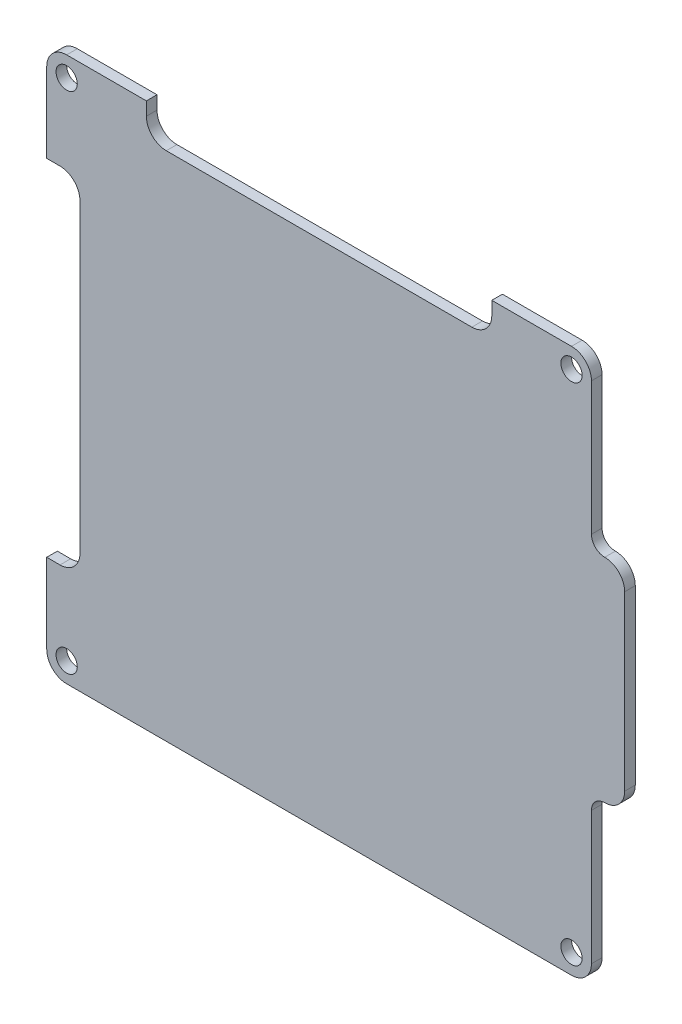
ISO-10303-21;
HEADER;
FILE_DESCRIPTION(('STEP AP214'),'2;1');
FILE_NAME('part.step','',(''),(''),'','','');
FILE_SCHEMA(('AUTOMOTIVE_DESIGN { 1 0 10303 214 1 1 1 1 }'));
ENDSEC;
DATA;
#1=APPLICATION_CONTEXT('core data for automotive mechanical design processes');
#2=APPLICATION_PROTOCOL_DEFINITION('international standard','automotive_design',2000,#1);
#3=PRODUCT_CONTEXT('',#1,'mechanical');
#4=PRODUCT('Part','Part','',(#3));
#5=PRODUCT_RELATED_PRODUCT_CATEGORY('part','',(#4));
#6=PRODUCT_DEFINITION_FORMATION('','',#4);
#7=PRODUCT_DEFINITION_CONTEXT('part definition',#1,'design');
#8=PRODUCT_DEFINITION('design','',#6,#7);
#9=PRODUCT_DEFINITION_SHAPE('','',#8);
#10=(LENGTH_UNIT() NAMED_UNIT(*) SI_UNIT(.MILLI.,.METRE.));
#11=(NAMED_UNIT(*) PLANE_ANGLE_UNIT() SI_UNIT($,.RADIAN.));
#12=(NAMED_UNIT(*) SI_UNIT($,.STERADIAN.) SOLID_ANGLE_UNIT());
#13=UNCERTAINTY_MEASURE_WITH_UNIT(LENGTH_MEASURE(1.E-05),#10,'distance_accuracy_value','');
#14=(GEOMETRIC_REPRESENTATION_CONTEXT(3) GLOBAL_UNCERTAINTY_ASSIGNED_CONTEXT((#13)) GLOBAL_UNIT_ASSIGNED_CONTEXT((#10,
#11,#12)) REPRESENTATION_CONTEXT('',''));
#15=CARTESIAN_POINT('',(0.,0.,0.));
#16=DIRECTION('',(0.,0.,1.));
#17=DIRECTION('',(1.,0.,0.));
#18=AXIS2_PLACEMENT_3D('',#15,#16,#17);
#19=CARTESIAN_POINT('',(-0.499999999999993,61.75,-1.6));
#20=DIRECTION('',(0.,0.,1.));
#21=DIRECTION('',(1.,0.,0.));
#22=AXIS2_PLACEMENT_3D('',#19,#20,#21);
#23=PLANE('',#22);
#24=CARTESIAN_POINT('',(-79.5000000000002,7.75000000000047,-1.6));
#25=DIRECTION('',(0.,0.,-1.));
#26=DIRECTION('',(-1.,0.,0.));
#27=AXIS2_PLACEMENT_3D('',#24,#25,#26);
#28=CIRCLE('',#27,1.59999999999999);
#29=CARTESIAN_POINT('',(-81.1000000000002,7.75000000000047,-1.6));
#30=VERTEX_POINT('',#29);
#31=EDGE_CURVE('E559',#30,#30,#28,.T.);
#32=ORIENTED_EDGE('',*,*,#31,.F.);
#33=EDGE_LOOP('',(#32));
#34=FACE_BOUND('',#33,.T.);
#35=DIRECTION('',(0.,1.,0.));
#36=VECTOR('',#35,1.);
#37=CARTESIAN_POINT('',(4.50000000000001,61.75,-1.6));
#38=LINE('',#37,#36);
#39=CARTESIAN_POINT('',(4.50000000000001,32.7500000000003,-1.6));
#40=VERTEX_POINT('',#39);
#41=CARTESIAN_POINT('',(4.50000000000001,58.75,-1.6));
#42=VERTEX_POINT('',#41);
#43=EDGE_CURVE('E226',#40,#42,#38,.T.);
#44=ORIENTED_EDGE('',*,*,#43,.F.);
#45=CARTESIAN_POINT('',(1.50000000000001,32.7500000000003,-1.6));
#46=DIRECTION('',(0.,0.,1.));
#47=DIRECTION('',(1.,0.,0.));
#48=AXIS2_PLACEMENT_3D('',#45,#46,#47);
#49=CIRCLE('',#48,3.);
#50=CARTESIAN_POINT('',(1.50000000000001,29.7500000000003,-1.6));
#51=VERTEX_POINT('',#50);
#52=EDGE_CURVE('E339',#40,#51,#49,.F.);
#53=ORIENTED_EDGE('',*,*,#52,.T.);
#54=CARTESIAN_POINT('',(1.50000000000001,27.7500000000003,-1.6));
#55=DIRECTION('',(0.,0.,1.));
#56=DIRECTION('',(1.,0.,0.));
#57=AXIS2_PLACEMENT_3D('',#54,#55,#56);
#58=CIRCLE('',#57,2.);
#59=CARTESIAN_POINT('',(-0.499999999999986,27.7500000000003,-1.6));
#60=VERTEX_POINT('',#59);
#61=EDGE_CURVE('E403',#51,#60,#58,.T.);
#62=ORIENTED_EDGE('',*,*,#61,.T.);
#63=DIRECTION('',(0.,1.,0.));
#64=VECTOR('',#63,1.);
#65=CARTESIAN_POINT('',(-0.499999999999987,29.7500000000003,-1.6));
#66=LINE('',#65,#64);
#67=CARTESIAN_POINT('',(-0.499999999999974,7.74999999999997,-1.6));
#68=VERTEX_POINT('',#67);
#69=EDGE_CURVE('E260',#68,#60,#66,.T.);
#70=ORIENTED_EDGE('',*,*,#69,.F.);
#71=CARTESIAN_POINT('',(-3.49999999999997,7.74999999999996,-1.6));
#72=DIRECTION('',(0.,0.,1.));
#73=DIRECTION('',(1.,0.,0.));
#74=AXIS2_PLACEMENT_3D('',#71,#72,#73);
#75=CIRCLE('',#74,3.);
#76=CARTESIAN_POINT('',(-3.49999999999997,4.74999999999996,-1.6));
#77=VERTEX_POINT('',#76);
#78=EDGE_CURVE('E333',#68,#77,#75,.F.);
#79=ORIENTED_EDGE('',*,*,#78,.T.);
#80=DIRECTION('',(1.,0.,0.));
#81=VECTOR('',#80,1.);
#82=CARTESIAN_POINT('',(-0.499999999999973,4.74999999999996,-1.6));
#83=LINE('',#82,#81);
#84=CARTESIAN_POINT('',(-79.5,4.74999999999995,-1.6));
#85=VERTEX_POINT('',#84);
#86=EDGE_CURVE('E257',#85,#77,#83,.T.);
#87=ORIENTED_EDGE('',*,*,#86,.F.);
#88=CARTESIAN_POINT('',(-79.5,7.74999999999995,-1.6));
#89=DIRECTION('',(0.,0.,1.));
#90=DIRECTION('',(1.,0.,0.));
#91=AXIS2_PLACEMENT_3D('',#88,#89,#90);
#92=CIRCLE('',#91,3.);
#93=CARTESIAN_POINT('',(-82.5,7.74999999999995,-1.6));
#94=VERTEX_POINT('',#93);
#95=EDGE_CURVE('E331',#85,#94,#92,.F.);
#96=ORIENTED_EDGE('',*,*,#95,.T.);
#97=DIRECTION('',(0.,-1.,0.));
#98=VECTOR('',#97,1.);
#99=CARTESIAN_POINT('',(-82.5,19.7500000000006,-1.6));
#100=LINE('',#99,#98);
#101=CARTESIAN_POINT('',(-82.5,19.7500000000006,-1.6));
#102=VERTEX_POINT('',#101);
#103=EDGE_CURVE('E254',#102,#94,#100,.T.);
#104=ORIENTED_EDGE('',*,*,#103,.F.);
#105=DIRECTION('',(-1.,0.,0.));
#106=VECTOR('',#105,1.);
#107=CARTESIAN_POINT('',(-77.5,19.7500000000006,-1.6));
#108=LINE('',#107,#106);
#109=CARTESIAN_POINT('',(-80.5,19.7500000000006,-1.6));
#110=VERTEX_POINT('',#109);
#111=EDGE_CURVE('E252',#110,#102,#108,.T.);
#112=ORIENTED_EDGE('',*,*,#111,.F.);
#113=CARTESIAN_POINT('',(-80.5,22.7500000000006,-1.6));
#114=DIRECTION('',(0.,0.,1.));
#115=DIRECTION('',(1.,0.,0.));
#116=AXIS2_PLACEMENT_3D('',#113,#114,#115);
#117=CIRCLE('',#116,3.);
#118=CARTESIAN_POINT('',(-77.5,22.7500000000006,-1.6));
#119=VERTEX_POINT('',#118);
#120=EDGE_CURVE('E395',#110,#119,#117,.T.);
#121=ORIENTED_EDGE('',*,*,#120,.T.);
#122=DIRECTION('',(0.,-1.,0.));
#123=VECTOR('',#122,1.);
#124=CARTESIAN_POINT('',(-77.5,71.7499999999999,-1.6));
#125=LINE('',#124,#123);
#126=CARTESIAN_POINT('',(-77.5,68.7499999999999,-1.6));
#127=VERTEX_POINT('',#126);
#128=EDGE_CURVE('E249',#127,#119,#125,.T.);
#129=ORIENTED_EDGE('',*,*,#128,.F.);
#130=CARTESIAN_POINT('',(-80.5,68.7499999999999,-1.6));
#131=DIRECTION('',(0.,0.,1.));
#132=DIRECTION('',(1.,0.,0.));
#133=AXIS2_PLACEMENT_3D('',#130,#131,#132);
#134=CIRCLE('',#133,3.);
#135=CARTESIAN_POINT('',(-80.5,71.7499999999999,-1.6));
#136=VERTEX_POINT('',#135);
#137=EDGE_CURVE('E391',#127,#136,#134,.T.);
#138=ORIENTED_EDGE('',*,*,#137,.T.);
#139=DIRECTION('',(1.,0.,0.));
#140=VECTOR('',#139,1.);
#141=CARTESIAN_POINT('',(-82.5,71.7499999999999,-1.6));
#142=LINE('',#141,#140);
#143=CARTESIAN_POINT('',(-82.5,71.7499999999999,-1.6));
#144=VERTEX_POINT('',#143);
#145=EDGE_CURVE('E246',#144,#136,#142,.T.);
#146=ORIENTED_EDGE('',*,*,#145,.F.);
#147=DIRECTION('',(0.,-1.,0.));
#148=VECTOR('',#147,1.);
#149=CARTESIAN_POINT('',(-82.5,86.75,-1.6));
#150=LINE('',#149,#148);
#151=CARTESIAN_POINT('',(-82.5,83.75,-1.6));
#152=VERTEX_POINT('',#151);
#153=EDGE_CURVE('E244',#152,#144,#150,.T.);
#154=ORIENTED_EDGE('',*,*,#153,.F.);
#155=CARTESIAN_POINT('',(-79.5,83.75,-1.6));
#156=DIRECTION('',(0.,0.,1.));
#157=DIRECTION('',(1.,0.,0.));
#158=AXIS2_PLACEMENT_3D('',#155,#156,#157);
#159=CIRCLE('',#158,3.);
#160=CARTESIAN_POINT('',(-79.5,86.75,-1.6));
#161=VERTEX_POINT('',#160);
#162=EDGE_CURVE('E329',#152,#161,#159,.F.);
#163=ORIENTED_EDGE('',*,*,#162,.T.);
#164=DIRECTION('',(-1.,0.,0.));
#165=VECTOR('',#164,1.);
#166=CARTESIAN_POINT('',(-67.5,86.7499999999999,-1.6));
#167=LINE('',#166,#165);
#168=CARTESIAN_POINT('',(-67.5,86.7499999999999,-1.6));
#169=VERTEX_POINT('',#168);
#170=EDGE_CURVE('E241',#169,#161,#167,.T.);
#171=ORIENTED_EDGE('',*,*,#170,.F.);
#172=DIRECTION('',(0.,1.,0.));
#173=VECTOR('',#172,1.);
#174=CARTESIAN_POINT('',(-67.5,81.7499999999999,-1.6));
#175=LINE('',#174,#173);
#176=CARTESIAN_POINT('',(-67.5,84.7499999999999,-1.6));
#177=VERTEX_POINT('',#176);
#178=EDGE_CURVE('E236',#177,#169,#175,.T.);
#179=ORIENTED_EDGE('',*,*,#178,.F.);
#180=CARTESIAN_POINT('',(-64.5,84.7499999999999,-1.6));
#181=DIRECTION('',(0.,0.,1.));
#182=DIRECTION('',(1.,0.,0.));
#183=AXIS2_PLACEMENT_3D('',#180,#181,#182);
#184=CIRCLE('',#183,3.);
#185=CARTESIAN_POINT('',(-64.5,81.7499999999999,-1.6));
#186=VERTEX_POINT('',#185);
#187=EDGE_CURVE('E384',#177,#186,#184,.T.);
#188=ORIENTED_EDGE('',*,*,#187,.T.);
#189=DIRECTION('',(-1.,0.,0.));
#190=VECTOR('',#189,1.);
#191=CARTESIAN_POINT('',(-15.5,81.7499999999999,-1.6));
#192=LINE('',#191,#190);
#193=CARTESIAN_POINT('',(-18.4999999999999,81.7499999999999,-1.6));
#194=VERTEX_POINT('',#193);
#195=EDGE_CURVE('E233',#194,#186,#192,.T.);
#196=ORIENTED_EDGE('',*,*,#195,.F.);
#197=CARTESIAN_POINT('',(-18.4999999999999,84.7499999999999,-1.6));
#198=DIRECTION('',(0.,0.,1.));
#199=DIRECTION('',(1.,0.,0.));
#200=AXIS2_PLACEMENT_3D('',#197,#198,#199);
#201=CIRCLE('',#200,3.);
#202=CARTESIAN_POINT('',(-15.4999999999999,84.7499999999998,-1.6));
#203=VERTEX_POINT('',#202);
#204=EDGE_CURVE('E232',#194,#203,#201,.T.);
#205=ORIENTED_EDGE('',*,*,#204,.T.);
#206=DIRECTION('',(0.,-1.,0.));
#207=VECTOR('',#206,1.);
#208=CARTESIAN_POINT('',(-15.4999999999998,86.7499999999999,-1.6));
#209=LINE('',#208,#207);
#210=CARTESIAN_POINT('',(-15.4999999999998,86.7499999999999,-1.6));
#211=VERTEX_POINT('',#210);
#212=EDGE_CURVE('E215',#211,#203,#209,.T.);
#213=ORIENTED_EDGE('',*,*,#212,.F.);
#214=DIRECTION('',(-1.,0.,0.));
#215=VECTOR('',#214,1.);
#216=CARTESIAN_POINT('',(-0.499999999999983,86.75,-1.6));
#217=LINE('',#216,#215);
#218=CARTESIAN_POINT('',(-3.50000000000001,86.75,-1.6));
#219=VERTEX_POINT('',#218);
#220=EDGE_CURVE('E203',#219,#211,#217,.T.);
#221=ORIENTED_EDGE('',*,*,#220,.F.);
#222=CARTESIAN_POINT('',(-3.49999999999998,83.75,-1.6));
#223=DIRECTION('',(0.,0.,1.));
#224=DIRECTION('',(1.,0.,0.));
#225=AXIS2_PLACEMENT_3D('',#222,#223,#224);
#226=CIRCLE('',#225,3.);
#227=CARTESIAN_POINT('',(-0.499999999999984,83.75,-1.6));
#228=VERTEX_POINT('',#227);
#229=EDGE_CURVE('E335',#219,#228,#226,.F.);
#230=ORIENTED_EDGE('',*,*,#229,.T.);
#231=DIRECTION('',(0.,1.,0.));
#232=VECTOR('',#231,1.);
#233=CARTESIAN_POINT('',(-0.499999999999983,86.75,-1.6));
#234=LINE('',#233,#232);
#235=CARTESIAN_POINT('',(-0.499999999999992,63.75,-1.6));
#236=VERTEX_POINT('',#235);
#237=EDGE_CURVE('E216',#236,#228,#234,.T.);
#238=ORIENTED_EDGE('',*,*,#237,.F.);
#239=CARTESIAN_POINT('',(1.50000000000001,63.75,-1.6));
#240=DIRECTION('',(0.,0.,1.));
#241=DIRECTION('',(1.,0.,0.));
#242=AXIS2_PLACEMENT_3D('',#239,#240,#241);
#243=CIRCLE('',#242,2.);
#244=CARTESIAN_POINT('',(1.50000000000001,61.75,-1.6));
#245=VERTEX_POINT('',#244);
#246=EDGE_CURVE('E11',#236,#245,#243,.T.);
#247=ORIENTED_EDGE('',*,*,#246,.T.);
#248=CARTESIAN_POINT('',(1.50000000000001,58.75,-1.6));
#249=DIRECTION('',(0.,0.,1.));
#250=DIRECTION('',(1.,0.,0.));
#251=AXIS2_PLACEMENT_3D('',#248,#249,#250);
#252=CIRCLE('',#251,3.);
#253=EDGE_CURVE('E337',#245,#42,#252,.F.);
#254=ORIENTED_EDGE('',*,*,#253,.T.);
#255=EDGE_LOOP('',(#44,#53,#62,#70,#79,#87,#96,#104,#112,#121,#129,#138,#146,#154,#163,#171,
#179,#188,#196,#205,#213,#221,#230,#238,#247,#254));
#256=FACE_BOUND('',#255,.T.);
#257=CARTESIAN_POINT('',(-79.5000000000002,83.7500000000005,-1.6));
#258=DIRECTION('',(0.,0.,-1.));
#259=DIRECTION('',(-1.,0.,0.));
#260=AXIS2_PLACEMENT_3D('',#257,#258,#259);
#261=CIRCLE('',#260,1.59999999999999);
#262=CARTESIAN_POINT('',(-81.1000000000002,83.7500000000005,-1.6));
#263=VERTEX_POINT('',#262);
#264=EDGE_CURVE('E553',#263,#263,#261,.T.);
#265=ORIENTED_EDGE('',*,*,#264,.F.);
#266=EDGE_LOOP('',(#265));
#267=FACE_BOUND('',#266,.T.);
#268=CARTESIAN_POINT('',(-3.50000000000006,7.75000000000042,-1.6));
#269=DIRECTION('',(0.,0.,-1.));
#270=DIRECTION('',(-1.,0.,0.));
#271=AXIS2_PLACEMENT_3D('',#268,#269,#270);
#272=CIRCLE('',#271,1.59999999999999);
#273=CARTESIAN_POINT('',(-5.10000000000005,7.75000000000042,-1.6));
#274=VERTEX_POINT('',#273);
#275=EDGE_CURVE('E565',#274,#274,#272,.T.);
#276=ORIENTED_EDGE('',*,*,#275,.F.);
#277=EDGE_LOOP('',(#276));
#278=FACE_BOUND('',#277,.T.);
#279=CARTESIAN_POINT('',(-3.49999999999998,83.7500000000004,-1.6));
#280=DIRECTION('',(0.,0.,-1.));
#281=DIRECTION('',(-1.,0.,0.));
#282=AXIS2_PLACEMENT_3D('',#279,#280,#281);
#283=CIRCLE('',#282,1.59999999999999);
#284=CARTESIAN_POINT('',(-5.09999999999996,83.7500000000004,-1.6));
#285=VERTEX_POINT('',#284);
#286=EDGE_CURVE('E571',#285,#285,#283,.T.);
#287=ORIENTED_EDGE('',*,*,#286,.F.);
#288=EDGE_LOOP('',(#287));
#289=FACE_BOUND('',#288,.T.);
#290=ADVANCED_FACE('F32',(#34,#256,#267,#278,#289),#23,.F.);
#291=CARTESIAN_POINT('',(-0.499999999999983,86.75,-1.6));
#292=DIRECTION('',(1.,0.,0.));
#293=DIRECTION('',(0.,1.,0.));
#294=AXIS2_PLACEMENT_3D('',#291,#292,#293);
#295=PLANE('',#294);
#296=DIRECTION('',(0.,1.,0.));
#297=VECTOR('',#296,1.);
#298=CARTESIAN_POINT('',(-0.499999999999983,86.75,0.));
#299=LINE('',#298,#297);
#300=CARTESIAN_POINT('',(-0.499999999999992,63.75,0.));
#301=VERTEX_POINT('',#300);
#302=CARTESIAN_POINT('',(-0.499999999999984,83.75,0.));
#303=VERTEX_POINT('',#302);
#304=EDGE_CURVE('E265',#301,#303,#299,.T.);
#305=ORIENTED_EDGE('',*,*,#304,.F.);
#306=DIRECTION('',(0.,0.,1.));
#307=VECTOR('',#306,1.);
#308=CARTESIAN_POINT('',(-0.499999999999992,63.75,-1.6));
#309=LINE('',#308,#307);
#310=EDGE_CURVE('E53',#301,#236,#309,.F.);
#311=ORIENTED_EDGE('',*,*,#310,.T.);
#312=ORIENTED_EDGE('',*,*,#237,.T.);
#313=DIRECTION('',(0.,0.,1.));
#314=VECTOR('',#313,1.);
#315=CARTESIAN_POINT('',(-0.499999999999984,83.75,-1.6));
#316=LINE('',#315,#314);
#317=EDGE_CURVE('E344',#228,#303,#316,.T.);
#318=ORIENTED_EDGE('',*,*,#317,.T.);
#319=EDGE_LOOP('',(#305,#311,#312,#318));
#320=FACE_BOUND('',#319,.T.);
#321=ADVANCED_FACE('F437',(#320),#295,.T.);
#322=CARTESIAN_POINT('',(4.50000000000001,61.75,-1.6));
#323=DIRECTION('',(1.,0.,0.));
#324=DIRECTION('',(0.,1.,0.));
#325=AXIS2_PLACEMENT_3D('',#322,#323,#324);
#326=PLANE('',#325);
#327=DIRECTION('',(0.,1.,0.));
#328=VECTOR('',#327,1.);
#329=CARTESIAN_POINT('',(4.50000000000001,61.75,0.));
#330=LINE('',#329,#328);
#331=CARTESIAN_POINT('',(4.50000000000001,32.7500000000003,0.));
#332=VERTEX_POINT('',#331);
#333=CARTESIAN_POINT('',(4.50000000000001,58.75,0.));
#334=VERTEX_POINT('',#333);
#335=EDGE_CURVE('E298',#332,#334,#330,.T.);
#336=ORIENTED_EDGE('',*,*,#335,.F.);
#337=DIRECTION('',(0.,0.,1.));
#338=VECTOR('',#337,1.);
#339=CARTESIAN_POINT('',(4.50000000000001,32.7500000000003,-1.6));
#340=LINE('',#339,#338);
#341=EDGE_CURVE('E327',#332,#40,#340,.F.);
#342=ORIENTED_EDGE('',*,*,#341,.T.);
#343=ORIENTED_EDGE('',*,*,#43,.T.);
#344=DIRECTION('',(0.,0.,1.));
#345=VECTOR('',#344,1.);
#346=CARTESIAN_POINT('',(4.50000000000001,58.75,-1.6));
#347=LINE('',#346,#345);
#348=EDGE_CURVE('E324',#42,#334,#347,.T.);
#349=ORIENTED_EDGE('',*,*,#348,.T.);
#350=EDGE_LOOP('',(#336,#342,#343,#349));
#351=FACE_BOUND('',#350,.T.);
#352=ADVANCED_FACE('F423',(#351),#326,.T.);
#353=CARTESIAN_POINT('',(-0.499999999999987,29.7500000000003,-1.6));
#354=DIRECTION('',(1.,0.,0.));
#355=DIRECTION('',(0.,1.,0.));
#356=AXIS2_PLACEMENT_3D('',#353,#354,#355);
#357=PLANE('',#356);
#358=ORIENTED_EDGE('',*,*,#69,.T.);
#359=DIRECTION('',(0.,0.,1.));
#360=VECTOR('',#359,1.);
#361=CARTESIAN_POINT('',(-0.499999999999986,27.7500000000003,0.));
#362=LINE('',#361,#360);
#363=CARTESIAN_POINT('',(-0.499999999999986,27.7500000000003,0.));
#364=VERTEX_POINT('',#363);
#365=EDGE_CURVE('E397',#60,#364,#362,.T.);
#366=ORIENTED_EDGE('',*,*,#365,.T.);
#367=DIRECTION('',(0.,1.,0.));
#368=VECTOR('',#367,1.);
#369=CARTESIAN_POINT('',(-0.499999999999987,29.7500000000003,0.));
#370=LINE('',#369,#368);
#371=CARTESIAN_POINT('',(-0.499999999999974,7.74999999999997,0.));
#372=VERTEX_POINT('',#371);
#373=EDGE_CURVE('E295',#372,#364,#370,.T.);
#374=ORIENTED_EDGE('',*,*,#373,.F.);
#375=DIRECTION('',(0.,0.,1.));
#376=VECTOR('',#375,1.);
#377=CARTESIAN_POINT('',(-0.499999999999974,7.74999999999997,-1.6));
#378=LINE('',#377,#376);
#379=EDGE_CURVE('E353',#372,#68,#378,.F.);
#380=ORIENTED_EDGE('',*,*,#379,.T.);
#381=EDGE_LOOP('',(#358,#366,#374,#380));
#382=FACE_BOUND('',#381,.T.);
#383=ADVANCED_FACE('F412',(#382),#357,.T.);
#384=CARTESIAN_POINT('',(-0.499999999999973,4.74999999999996,-1.6));
#385=DIRECTION('',(0.,-1.,0.));
#386=DIRECTION('',(1.,0.,0.));
#387=AXIS2_PLACEMENT_3D('',#384,#385,#386);
#388=PLANE('',#387);
#389=ORIENTED_EDGE('',*,*,#86,.T.);
#390=DIRECTION('',(0.,0.,1.));
#391=VECTOR('',#390,1.);
#392=CARTESIAN_POINT('',(-3.49999999999997,4.74999999999996,-1.6));
#393=LINE('',#392,#391);
#394=CARTESIAN_POINT('',(-3.49999999999997,4.74999999999996,0.));
#395=VERTEX_POINT('',#394);
#396=EDGE_CURVE('E350',#77,#395,#393,.T.);
#397=ORIENTED_EDGE('',*,*,#396,.T.);
#398=DIRECTION('',(1.,0.,0.));
#399=VECTOR('',#398,1.);
#400=CARTESIAN_POINT('',(-0.499999999999973,4.74999999999996,0.));
#401=LINE('',#400,#399);
#402=CARTESIAN_POINT('',(-79.5,4.74999999999995,0.));
#403=VERTEX_POINT('',#402);
#404=EDGE_CURVE('E292',#403,#395,#401,.T.);
#405=ORIENTED_EDGE('',*,*,#404,.F.);
#406=DIRECTION('',(0.,0.,1.));
#407=VECTOR('',#406,1.);
#408=CARTESIAN_POINT('',(-79.5,4.74999999999995,-1.6));
#409=LINE('',#408,#407);
#410=EDGE_CURVE('E348',#403,#85,#409,.F.);
#411=ORIENTED_EDGE('',*,*,#410,.T.);
#412=EDGE_LOOP('',(#389,#397,#405,#411));
#413=FACE_BOUND('',#412,.T.);
#414=ADVANCED_FACE('F456',(#413),#388,.T.);
#415=CARTESIAN_POINT('',(-82.5,19.7500000000006,-1.6));
#416=DIRECTION('',(-1.,0.,0.));
#417=DIRECTION('',(0.,-1.,0.));
#418=AXIS2_PLACEMENT_3D('',#415,#416,#417);
#419=PLANE('',#418);
#420=ORIENTED_EDGE('',*,*,#103,.T.);
#421=DIRECTION('',(0.,0.,1.));
#422=VECTOR('',#421,1.);
#423=CARTESIAN_POINT('',(-82.5,7.74999999999995,-1.6));
#424=LINE('',#423,#422);
#425=CARTESIAN_POINT('',(-82.5,7.74999999999995,0.));
#426=VERTEX_POINT('',#425);
#427=EDGE_CURVE('E355',#94,#426,#424,.T.);
#428=ORIENTED_EDGE('',*,*,#427,.T.);
#429=DIRECTION('',(0.,-1.,0.));
#430=VECTOR('',#429,1.);
#431=CARTESIAN_POINT('',(-82.5,19.7500000000006,0.));
#432=LINE('',#431,#430);
#433=CARTESIAN_POINT('',(-82.5,19.7500000000006,0.));
#434=VERTEX_POINT('',#433);
#435=EDGE_CURVE('E289',#434,#426,#432,.T.);
#436=ORIENTED_EDGE('',*,*,#435,.F.);
#437=DIRECTION('',(0.,0.,1.));
#438=VECTOR('',#437,1.);
#439=CARTESIAN_POINT('',(-82.5,19.7500000000006,-1.6));
#440=LINE('',#439,#438);
#441=EDGE_CURVE('E301',#102,#434,#440,.T.);
#442=ORIENTED_EDGE('',*,*,#441,.F.);
#443=EDGE_LOOP('',(#420,#428,#436,#442));
#444=FACE_BOUND('',#443,.T.);
#445=ADVANCED_FACE('F459',(#444),#419,.T.);
#446=CARTESIAN_POINT('',(-77.5,19.7500000000006,-1.6));
#447=DIRECTION('',(0.,1.,0.));
#448=DIRECTION('',(0.,0.,1.));
#449=AXIS2_PLACEMENT_3D('',#446,#447,#448);
#450=PLANE('',#449);
#451=DIRECTION('',(-1.,0.,0.));
#452=VECTOR('',#451,1.);
#453=CARTESIAN_POINT('',(-77.5,19.7500000000006,0.));
#454=LINE('',#453,#452);
#455=CARTESIAN_POINT('',(-80.5,19.7500000000006,0.));
#456=VERTEX_POINT('',#455);
#457=EDGE_CURVE('E287',#456,#434,#454,.T.);
#458=ORIENTED_EDGE('',*,*,#457,.F.);
#459=DIRECTION('',(0.,0.,1.));
#460=VECTOR('',#459,1.);
#461=CARTESIAN_POINT('',(-80.5,19.7500000000006,-1.6));
#462=LINE('',#461,#460);
#463=EDGE_CURVE('E375',#456,#110,#462,.F.);
#464=ORIENTED_EDGE('',*,*,#463,.T.);
#465=ORIENTED_EDGE('',*,*,#111,.T.);
#466=ORIENTED_EDGE('',*,*,#441,.T.);
#467=EDGE_LOOP('',(#458,#464,#465,#466));
#468=FACE_BOUND('',#467,.T.);
#469=ADVANCED_FACE('F463',(#468),#450,.T.);
#470=CARTESIAN_POINT('',(-77.5,71.7499999999999,-1.6));
#471=DIRECTION('',(-1.,0.,0.));
#472=DIRECTION('',(0.,-1.,0.));
#473=AXIS2_PLACEMENT_3D('',#470,#471,#472);
#474=PLANE('',#473);
#475=DIRECTION('',(0.,-1.,0.));
#476=VECTOR('',#475,1.);
#477=CARTESIAN_POINT('',(-77.5,71.7499999999999,0.));
#478=LINE('',#477,#476);
#479=CARTESIAN_POINT('',(-77.5,68.7499999999999,0.));
#480=VERTEX_POINT('',#479);
#481=CARTESIAN_POINT('',(-77.5,22.7500000000006,0.));
#482=VERTEX_POINT('',#481);
#483=EDGE_CURVE('E284',#480,#482,#478,.T.);
#484=ORIENTED_EDGE('',*,*,#483,.F.);
#485=DIRECTION('',(0.,0.,1.));
#486=VECTOR('',#485,1.);
#487=CARTESIAN_POINT('',(-77.5,68.7499999999999,-1.6));
#488=LINE('',#487,#486);
#489=EDGE_CURVE('E373',#480,#127,#488,.F.);
#490=ORIENTED_EDGE('',*,*,#489,.T.);
#491=ORIENTED_EDGE('',*,*,#128,.T.);
#492=DIRECTION('',(0.,0.,1.));
#493=VECTOR('',#492,1.);
#494=CARTESIAN_POINT('',(-77.5,22.7500000000006,0.));
#495=LINE('',#494,#493);
#496=EDGE_CURVE('E370',#119,#482,#495,.T.);
#497=ORIENTED_EDGE('',*,*,#496,.T.);
#498=EDGE_LOOP('',(#484,#490,#491,#497));
#499=FACE_BOUND('',#498,.T.);
#500=ADVANCED_FACE('F467',(#499),#474,.T.);
#501=CARTESIAN_POINT('',(-82.5,71.7499999999999,-1.6));
#502=DIRECTION('',(0.,-1.,0.));
#503=DIRECTION('',(0.,0.,-1.));
#504=AXIS2_PLACEMENT_3D('',#501,#502,#503);
#505=PLANE('',#504);
#506=ORIENTED_EDGE('',*,*,#145,.T.);
#507=DIRECTION('',(0.,0.,1.));
#508=VECTOR('',#507,1.);
#509=CARTESIAN_POINT('',(-80.5,71.7499999999999,0.));
#510=LINE('',#509,#508);
#511=CARTESIAN_POINT('',(-80.5,71.7499999999999,0.));
#512=VERTEX_POINT('',#511);
#513=EDGE_CURVE('E367',#136,#512,#510,.T.);
#514=ORIENTED_EDGE('',*,*,#513,.T.);
#515=DIRECTION('',(1.,0.,0.));
#516=VECTOR('',#515,1.);
#517=CARTESIAN_POINT('',(-82.5,71.7499999999999,0.));
#518=LINE('',#517,#516);
#519=CARTESIAN_POINT('',(-82.5,71.7499999999999,0.));
#520=VERTEX_POINT('',#519);
#521=EDGE_CURVE('E281',#520,#512,#518,.T.);
#522=ORIENTED_EDGE('',*,*,#521,.F.);
#523=DIRECTION('',(0.,0.,1.));
#524=VECTOR('',#523,1.);
#525=CARTESIAN_POINT('',(-82.5,71.7499999999999,-1.6));
#526=LINE('',#525,#524);
#527=EDGE_CURVE('E305',#144,#520,#526,.T.);
#528=ORIENTED_EDGE('',*,*,#527,.F.);
#529=EDGE_LOOP('',(#506,#514,#522,#528));
#530=FACE_BOUND('',#529,.T.);
#531=ADVANCED_FACE('F471',(#530),#505,.T.);
#532=CARTESIAN_POINT('',(-82.5,86.75,-1.6));
#533=DIRECTION('',(-1.,0.,0.));
#534=DIRECTION('',(0.,-1.,0.));
#535=AXIS2_PLACEMENT_3D('',#532,#533,#534);
#536=PLANE('',#535);
#537=DIRECTION('',(0.,-1.,0.));
#538=VECTOR('',#537,1.);
#539=CARTESIAN_POINT('',(-82.5,86.75,0.));
#540=LINE('',#539,#538);
#541=CARTESIAN_POINT('',(-82.5,83.75,0.));
#542=VERTEX_POINT('',#541);
#543=EDGE_CURVE('E279',#542,#520,#540,.T.);
#544=ORIENTED_EDGE('',*,*,#543,.F.);
#545=DIRECTION('',(0.,0.,1.));
#546=VECTOR('',#545,1.);
#547=CARTESIAN_POINT('',(-82.5,83.75,-1.6));
#548=LINE('',#547,#546);
#549=EDGE_CURVE('E380',#542,#152,#548,.F.);
#550=ORIENTED_EDGE('',*,*,#549,.T.);
#551=ORIENTED_EDGE('',*,*,#153,.T.);
#552=ORIENTED_EDGE('',*,*,#527,.T.);
#553=EDGE_LOOP('',(#544,#550,#551,#552));
#554=FACE_BOUND('',#553,.T.);
#555=ADVANCED_FACE('F475',(#554),#536,.T.);
#556=CARTESIAN_POINT('',(-67.5,86.7499999999999,-1.6));
#557=DIRECTION('',(0.,1.,0.));
#558=DIRECTION('',(-1.,0.,0.));
#559=AXIS2_PLACEMENT_3D('',#556,#557,#558);
#560=PLANE('',#559);
#561=ORIENTED_EDGE('',*,*,#170,.T.);
#562=DIRECTION('',(0.,0.,1.));
#563=VECTOR('',#562,1.);
#564=CARTESIAN_POINT('',(-79.5,86.75,-1.6));
#565=LINE('',#564,#563);
#566=CARTESIAN_POINT('',(-79.5,86.75,0.));
#567=VERTEX_POINT('',#566);
#568=EDGE_CURVE('E377',#161,#567,#565,.T.);
#569=ORIENTED_EDGE('',*,*,#568,.T.);
#570=DIRECTION('',(-1.,0.,0.));
#571=VECTOR('',#570,1.);
#572=CARTESIAN_POINT('',(-67.5,86.7499999999999,0.));
#573=LINE('',#572,#571);
#574=CARTESIAN_POINT('',(-67.5,86.7499999999999,0.));
#575=VERTEX_POINT('',#574);
#576=EDGE_CURVE('E276',#575,#567,#573,.T.);
#577=ORIENTED_EDGE('',*,*,#576,.F.);
#578=DIRECTION('',(0.,0.,1.));
#579=VECTOR('',#578,1.);
#580=CARTESIAN_POINT('',(-67.5,86.7499999999999,-1.6));
#581=LINE('',#580,#579);
#582=EDGE_CURVE('E225',#169,#575,#581,.T.);
#583=ORIENTED_EDGE('',*,*,#582,.F.);
#584=EDGE_LOOP('',(#561,#569,#577,#583));
#585=FACE_BOUND('',#584,.T.);
#586=ADVANCED_FACE('F479',(#585),#560,.T.);
#587=CARTESIAN_POINT('',(-67.5,81.7499999999999,-1.6));
#588=DIRECTION('',(1.,0.,0.));
#589=DIRECTION('',(0.,0.,-1.));
#590=AXIS2_PLACEMENT_3D('',#587,#588,#589);
#591=PLANE('',#590);
#592=DIRECTION('',(0.,1.,0.));
#593=VECTOR('',#592,1.);
#594=CARTESIAN_POINT('',(-67.5,81.7499999999999,0.));
#595=LINE('',#594,#593);
#596=CARTESIAN_POINT('',(-67.5,84.7499999999999,0.));
#597=VERTEX_POINT('',#596);
#598=EDGE_CURVE('E274',#597,#575,#595,.T.);
#599=ORIENTED_EDGE('',*,*,#598,.F.);
#600=DIRECTION('',(0.,0.,1.));
#601=VECTOR('',#600,1.);
#602=CARTESIAN_POINT('',(-67.5,84.7499999999999,-1.6));
#603=LINE('',#602,#601);
#604=EDGE_CURVE('E363',#597,#177,#603,.F.);
#605=ORIENTED_EDGE('',*,*,#604,.T.);
#606=ORIENTED_EDGE('',*,*,#178,.T.);
#607=ORIENTED_EDGE('',*,*,#582,.T.);
#608=EDGE_LOOP('',(#599,#605,#606,#607));
#609=FACE_BOUND('',#608,.T.);
#610=ADVANCED_FACE('F483',(#609),#591,.T.);
#611=CARTESIAN_POINT('',(-15.5,81.7499999999999,-1.6));
#612=DIRECTION('',(0.,1.,0.));
#613=DIRECTION('',(0.,0.,1.));
#614=AXIS2_PLACEMENT_3D('',#611,#612,#613);
#615=PLANE('',#614);
#616=ORIENTED_EDGE('',*,*,#195,.T.);
#617=DIRECTION('',(0.,0.,1.));
#618=VECTOR('',#617,1.);
#619=CARTESIAN_POINT('',(-64.5,81.7499999999999,0.));
#620=LINE('',#619,#618);
#621=CARTESIAN_POINT('',(-64.5,81.7499999999999,0.));
#622=VERTEX_POINT('',#621);
#623=EDGE_CURVE('E360',#186,#622,#620,.T.);
#624=ORIENTED_EDGE('',*,*,#623,.T.);
#625=DIRECTION('',(-1.,0.,0.));
#626=VECTOR('',#625,1.);
#627=CARTESIAN_POINT('',(-15.5,81.7499999999999,0.));
#628=LINE('',#627,#626);
#629=CARTESIAN_POINT('',(-18.4999999999999,81.7499999999999,0.));
#630=VERTEX_POINT('',#629);
#631=EDGE_CURVE('E271',#630,#622,#628,.T.);
#632=ORIENTED_EDGE('',*,*,#631,.F.);
#633=DIRECTION('',(0.,0.,1.));
#634=VECTOR('',#633,1.);
#635=CARTESIAN_POINT('',(-18.4999999999999,81.7499999999999,-1.6));
#636=LINE('',#635,#634);
#637=EDGE_CURVE('E358',#630,#194,#636,.F.);
#638=ORIENTED_EDGE('',*,*,#637,.T.);
#639=EDGE_LOOP('',(#616,#624,#632,#638));
#640=FACE_BOUND('',#639,.T.);
#641=ADVANCED_FACE('F487',(#640),#615,.T.);
#642=CARTESIAN_POINT('',(-15.4999999999998,86.7499999999999,-1.6));
#643=DIRECTION('',(-1.,0.,0.));
#644=DIRECTION('',(0.,-1.,0.));
#645=AXIS2_PLACEMENT_3D('',#642,#643,#644);
#646=PLANE('',#645);
#647=ORIENTED_EDGE('',*,*,#212,.T.);
#648=DIRECTION('',(0.,0.,1.));
#649=VECTOR('',#648,1.);
#650=CARTESIAN_POINT('',(-15.4999999999999,84.7499999999998,0.));
#651=LINE('',#650,#649);
#652=CARTESIAN_POINT('',(-15.4999999999999,84.7499999999998,0.));
#653=VERTEX_POINT('',#652);
#654=EDGE_CURVE('E365',#203,#653,#651,.T.);
#655=ORIENTED_EDGE('',*,*,#654,.T.);
#656=DIRECTION('',(0.,-1.,0.));
#657=VECTOR('',#656,1.);
#658=CARTESIAN_POINT('',(-15.4999999999998,86.7499999999999,0.));
#659=LINE('',#658,#657);
#660=CARTESIAN_POINT('',(-15.4999999999998,86.7499999999999,0.));
#661=VERTEX_POINT('',#660);
#662=EDGE_CURVE('E224',#661,#653,#659,.T.);
#663=ORIENTED_EDGE('',*,*,#662,.F.);
#664=DIRECTION('',(0.,0.,1.));
#665=VECTOR('',#664,1.);
#666=CARTESIAN_POINT('',(-15.4999999999998,86.7499999999999,-1.6));
#667=LINE('',#666,#665);
#668=EDGE_CURVE('E207',#211,#661,#667,.T.);
#669=ORIENTED_EDGE('',*,*,#668,.F.);
#670=EDGE_LOOP('',(#647,#655,#663,#669));
#671=FACE_BOUND('',#670,.T.);
#672=ADVANCED_FACE('F220',(#671),#646,.T.);
#673=CARTESIAN_POINT('',(-0.499999999999983,86.75,-1.6));
#674=DIRECTION('',(0.,1.,0.));
#675=DIRECTION('',(-1.,0.,0.));
#676=AXIS2_PLACEMENT_3D('',#673,#674,#675);
#677=PLANE('',#676);
#678=DIRECTION('',(-1.,0.,0.));
#679=VECTOR('',#678,1.);
#680=CARTESIAN_POINT('',(-0.499999999999983,86.75,0.));
#681=LINE('',#680,#679);
#682=CARTESIAN_POINT('',(-3.50000000000001,86.75,0.));
#683=VERTEX_POINT('',#682);
#684=EDGE_CURVE('E267',#683,#661,#681,.T.);
#685=ORIENTED_EDGE('',*,*,#684,.F.);
#686=DIRECTION('',(0.,0.,1.));
#687=VECTOR('',#686,1.);
#688=CARTESIAN_POINT('',(-3.50000000000001,86.75,-1.6));
#689=LINE('',#688,#687);
#690=EDGE_CURVE('E210',#683,#219,#689,.F.);
#691=ORIENTED_EDGE('',*,*,#690,.T.);
#692=ORIENTED_EDGE('',*,*,#220,.T.);
#693=ORIENTED_EDGE('',*,*,#668,.T.);
#694=EDGE_LOOP('',(#685,#691,#692,#693));
#695=FACE_BOUND('',#694,.T.);
#696=ADVANCED_FACE('F206',(#695),#677,.T.);
#697=CARTESIAN_POINT('',(-0.499999999999993,61.75,0.));
#698=DIRECTION('',(0.,0.,1.));
#699=DIRECTION('',(1.,0.,0.));
#700=AXIS2_PLACEMENT_3D('',#697,#698,#699);
#701=PLANE('',#700);
#702=CARTESIAN_POINT('',(-3.49999999999998,83.7500000000004,0.));
#703=DIRECTION('',(0.,0.,1.));
#704=DIRECTION('',(1.,0.,0.));
#705=AXIS2_PLACEMENT_3D('',#702,#703,#704);
#706=CIRCLE('',#705,1.59999999999999);
#707=CARTESIAN_POINT('',(-1.89999999999998,83.7500000000004,0.));
#708=VERTEX_POINT('',#707);
#709=EDGE_CURVE('E568',#708,#708,#706,.T.);
#710=ORIENTED_EDGE('',*,*,#709,.F.);
#711=EDGE_LOOP('',(#710));
#712=FACE_BOUND('',#711,.T.);
#713=CARTESIAN_POINT('',(-3.50000000000006,7.75000000000042,0.));
#714=DIRECTION('',(0.,0.,1.));
#715=DIRECTION('',(1.,0.,0.));
#716=AXIS2_PLACEMENT_3D('',#713,#714,#715);
#717=CIRCLE('',#716,1.59999999999999);
#718=CARTESIAN_POINT('',(-1.90000000000007,7.75000000000042,0.));
#719=VERTEX_POINT('',#718);
#720=EDGE_CURVE('E562',#719,#719,#717,.T.);
#721=ORIENTED_EDGE('',*,*,#720,.F.);
#722=EDGE_LOOP('',(#721));
#723=FACE_BOUND('',#722,.T.);
#724=CARTESIAN_POINT('',(-79.5000000000002,7.75000000000047,0.));
#725=DIRECTION('',(0.,0.,1.));
#726=DIRECTION('',(1.,0.,0.));
#727=AXIS2_PLACEMENT_3D('',#724,#725,#726);
#728=CIRCLE('',#727,1.6);
#729=CARTESIAN_POINT('',(-77.9000000000002,7.75000000000047,0.));
#730=VERTEX_POINT('',#729);
#731=EDGE_CURVE('E556',#730,#730,#728,.T.);
#732=ORIENTED_EDGE('',*,*,#731,.F.);
#733=EDGE_LOOP('',(#732));
#734=FACE_BOUND('',#733,.T.);
#735=CARTESIAN_POINT('',(-79.5000000000002,83.7500000000005,0.));
#736=DIRECTION('',(0.,0.,1.));
#737=DIRECTION('',(1.,0.,0.));
#738=AXIS2_PLACEMENT_3D('',#735,#736,#737);
#739=CIRCLE('',#738,1.6);
#740=CARTESIAN_POINT('',(-77.9000000000002,83.7500000000005,0.));
#741=VERTEX_POINT('',#740);
#742=EDGE_CURVE('E268',#741,#741,#739,.T.);
#743=ORIENTED_EDGE('',*,*,#742,.F.);
#744=EDGE_LOOP('',(#743));
#745=FACE_BOUND('',#744,.T.);
#746=ORIENTED_EDGE('',*,*,#373,.T.);
#747=CARTESIAN_POINT('',(1.50000000000001,27.7500000000003,0.));
#748=DIRECTION('',(0.,0.,1.));
#749=DIRECTION('',(1.,0.,0.));
#750=AXIS2_PLACEMENT_3D('',#747,#748,#749);
#751=CIRCLE('',#750,2.);
#752=CARTESIAN_POINT('',(1.50000000000001,29.7500000000003,0.));
#753=VERTEX_POINT('',#752);
#754=EDGE_CURVE('E401',#364,#753,#751,.F.);
#755=ORIENTED_EDGE('',*,*,#754,.T.);
#756=CARTESIAN_POINT('',(1.50000000000001,32.7500000000003,0.));
#757=DIRECTION('',(0.,0.,1.));
#758=DIRECTION('',(1.,0.,0.));
#759=AXIS2_PLACEMENT_3D('',#756,#757,#758);
#760=CIRCLE('',#759,3.);
#761=EDGE_CURVE('E322',#753,#332,#760,.T.);
#762=ORIENTED_EDGE('',*,*,#761,.T.);
#763=ORIENTED_EDGE('',*,*,#335,.T.);
#764=CARTESIAN_POINT('',(1.50000000000001,58.75,0.));
#765=DIRECTION('',(0.,0.,1.));
#766=DIRECTION('',(1.,0.,0.));
#767=AXIS2_PLACEMENT_3D('',#764,#765,#766);
#768=CIRCLE('',#767,3.);
#769=CARTESIAN_POINT('',(1.50000000000001,61.75,0.));
#770=VERTEX_POINT('',#769);
#771=EDGE_CURVE('E320',#334,#770,#768,.T.);
#772=ORIENTED_EDGE('',*,*,#771,.T.);
#773=CARTESIAN_POINT('',(1.50000000000001,63.75,0.));
#774=DIRECTION('',(0.,0.,1.));
#775=DIRECTION('',(1.,0.,0.));
#776=AXIS2_PLACEMENT_3D('',#773,#774,#775);
#777=CIRCLE('',#776,2.);
#778=EDGE_CURVE('E40',#770,#301,#777,.F.);
#779=ORIENTED_EDGE('',*,*,#778,.T.);
#780=ORIENTED_EDGE('',*,*,#304,.T.);
#781=CARTESIAN_POINT('',(-3.49999999999998,83.75,0.));
#782=DIRECTION('',(0.,0.,1.));
#783=DIRECTION('',(1.,0.,0.));
#784=AXIS2_PLACEMENT_3D('',#781,#782,#783);
#785=CIRCLE('',#784,3.);
#786=EDGE_CURVE('E318',#303,#683,#785,.T.);
#787=ORIENTED_EDGE('',*,*,#786,.T.);
#788=ORIENTED_EDGE('',*,*,#684,.T.);
#789=ORIENTED_EDGE('',*,*,#662,.T.);
#790=CARTESIAN_POINT('',(-18.4999999999999,84.7499999999999,0.));
#791=DIRECTION('',(0.,0.,1.));
#792=DIRECTION('',(1.,0.,0.));
#793=AXIS2_PLACEMENT_3D('',#790,#791,#792);
#794=CIRCLE('',#793,3.);
#795=EDGE_CURVE('E386',#653,#630,#794,.F.);
#796=ORIENTED_EDGE('',*,*,#795,.T.);
#797=ORIENTED_EDGE('',*,*,#631,.T.);
#798=CARTESIAN_POINT('',(-64.5,84.7499999999999,0.));
#799=DIRECTION('',(0.,0.,1.));
#800=DIRECTION('',(1.,0.,0.));
#801=AXIS2_PLACEMENT_3D('',#798,#799,#800);
#802=CIRCLE('',#801,3.);
#803=EDGE_CURVE('E382',#622,#597,#802,.F.);
#804=ORIENTED_EDGE('',*,*,#803,.T.);
#805=ORIENTED_EDGE('',*,*,#598,.T.);
#806=ORIENTED_EDGE('',*,*,#576,.T.);
#807=CARTESIAN_POINT('',(-79.5,83.75,0.));
#808=DIRECTION('',(0.,0.,1.));
#809=DIRECTION('',(1.,0.,0.));
#810=AXIS2_PLACEMENT_3D('',#807,#808,#809);
#811=CIRCLE('',#810,3.);
#812=EDGE_CURVE('E312',#567,#542,#811,.T.);
#813=ORIENTED_EDGE('',*,*,#812,.T.);
#814=ORIENTED_EDGE('',*,*,#543,.T.);
#815=ORIENTED_EDGE('',*,*,#521,.T.);
#816=CARTESIAN_POINT('',(-80.5,68.7499999999999,0.));
#817=DIRECTION('',(0.,0.,1.));
#818=DIRECTION('',(1.,0.,0.));
#819=AXIS2_PLACEMENT_3D('',#816,#817,#818);
#820=CIRCLE('',#819,3.);
#821=EDGE_CURVE('E389',#512,#480,#820,.F.);
#822=ORIENTED_EDGE('',*,*,#821,.T.);
#823=ORIENTED_EDGE('',*,*,#483,.T.);
#824=CARTESIAN_POINT('',(-80.5,22.7500000000006,0.));
#825=DIRECTION('',(0.,0.,1.));
#826=DIRECTION('',(1.,0.,0.));
#827=AXIS2_PLACEMENT_3D('',#824,#825,#826);
#828=CIRCLE('',#827,3.);
#829=EDGE_CURVE('E393',#482,#456,#828,.F.);
#830=ORIENTED_EDGE('',*,*,#829,.T.);
#831=ORIENTED_EDGE('',*,*,#457,.T.);
#832=ORIENTED_EDGE('',*,*,#435,.T.);
#833=CARTESIAN_POINT('',(-79.5,7.74999999999995,0.));
#834=DIRECTION('',(0.,0.,1.));
#835=DIRECTION('',(1.,0.,0.));
#836=AXIS2_PLACEMENT_3D('',#833,#834,#835);
#837=CIRCLE('',#836,3.);
#838=EDGE_CURVE('E314',#426,#403,#837,.T.);
#839=ORIENTED_EDGE('',*,*,#838,.T.);
#840=ORIENTED_EDGE('',*,*,#404,.T.);
#841=CARTESIAN_POINT('',(-3.49999999999997,7.74999999999996,0.));
#842=DIRECTION('',(0.,0.,1.));
#843=DIRECTION('',(1.,0.,0.));
#844=AXIS2_PLACEMENT_3D('',#841,#842,#843);
#845=CIRCLE('',#844,3.);
#846=EDGE_CURVE('E316',#395,#372,#845,.T.);
#847=ORIENTED_EDGE('',*,*,#846,.T.);
#848=EDGE_LOOP('',(#746,#755,#762,#763,#772,#779,#780,#787,#788,#789,#796,#797,#804,#805,#806,
#813,#814,#815,#822,#823,#830,#831,#832,#839,#840,#847));
#849=FACE_BOUND('',#848,.T.);
#850=ADVANCED_FACE('F417',(#712,#723,#734,#745,#849),#701,.T.);
#851=CARTESIAN_POINT('',(-79.5000000000002,83.7500000000005,-1.6));
#852=DIRECTION('',(0.,0.,-1.));
#853=DIRECTION('',(-1.,0.,0.));
#854=AXIS2_PLACEMENT_3D('',#851,#852,#853);
#855=CYLINDRICAL_SURFACE('',#854,1.6);
#856=ORIENTED_EDGE('',*,*,#264,.T.);
#857=EDGE_LOOP('',(#856));
#858=FACE_BOUND('',#857,.T.);
#859=ORIENTED_EDGE('',*,*,#742,.T.);
#860=EDGE_LOOP('',(#859));
#861=FACE_BOUND('',#860,.T.);
#862=ADVANCED_FACE('F447',(#858,#861),#855,.F.);
#863=CARTESIAN_POINT('',(-79.5000000000002,7.75000000000047,-1.6));
#864=DIRECTION('',(0.,0.,-1.));
#865=DIRECTION('',(-1.,0.,0.));
#866=AXIS2_PLACEMENT_3D('',#863,#864,#865);
#867=CYLINDRICAL_SURFACE('',#866,1.6);
#868=ORIENTED_EDGE('',*,*,#31,.T.);
#869=EDGE_LOOP('',(#868));
#870=FACE_BOUND('',#869,.T.);
#871=ORIENTED_EDGE('',*,*,#731,.T.);
#872=EDGE_LOOP('',(#871));
#873=FACE_BOUND('',#872,.T.);
#874=ADVANCED_FACE('F589',(#870,#873),#867,.F.);
#875=CARTESIAN_POINT('',(-3.50000000000006,7.75000000000042,-1.6));
#876=DIRECTION('',(0.,0.,-1.));
#877=DIRECTION('',(-1.,0.,0.));
#878=AXIS2_PLACEMENT_3D('',#875,#876,#877);
#879=CYLINDRICAL_SURFACE('',#878,1.59999999999999);
#880=ORIENTED_EDGE('',*,*,#275,.T.);
#881=EDGE_LOOP('',(#880));
#882=FACE_BOUND('',#881,.T.);
#883=ORIENTED_EDGE('',*,*,#720,.T.);
#884=EDGE_LOOP('',(#883));
#885=FACE_BOUND('',#884,.T.);
#886=ADVANCED_FACE('F578',(#882,#885),#879,.F.);
#887=CARTESIAN_POINT('',(-3.49999999999998,83.7500000000004,-1.6));
#888=DIRECTION('',(0.,0.,-1.));
#889=DIRECTION('',(-1.,0.,0.));
#890=AXIS2_PLACEMENT_3D('',#887,#888,#889);
#891=CYLINDRICAL_SURFACE('',#890,1.59999999999999);
#892=ORIENTED_EDGE('',*,*,#286,.T.);
#893=EDGE_LOOP('',(#892));
#894=FACE_BOUND('',#893,.T.);
#895=ORIENTED_EDGE('',*,*,#709,.T.);
#896=EDGE_LOOP('',(#895));
#897=FACE_BOUND('',#896,.T.);
#898=ADVANCED_FACE('F498',(#894,#897),#891,.F.);
#899=CARTESIAN_POINT('',(1.50000000000001,32.7500000000003,-1.6));
#900=DIRECTION('',(0.,0.,1.));
#901=DIRECTION('',(1.,0.,0.));
#902=AXIS2_PLACEMENT_3D('',#899,#900,#901);
#903=CYLINDRICAL_SURFACE('',#902,3.);
#904=ORIENTED_EDGE('',*,*,#52,.F.);
#905=ORIENTED_EDGE('',*,*,#341,.F.);
#906=ORIENTED_EDGE('',*,*,#761,.F.);
#907=DIRECTION('',(0.,0.,1.));
#908=VECTOR('',#907,1.);
#909=CARTESIAN_POINT('',(1.50000000000001,29.7500000000003,-1.6));
#910=LINE('',#909,#908);
#911=EDGE_CURVE('E304',#51,#753,#910,.T.);
#912=ORIENTED_EDGE('',*,*,#911,.F.);
#913=EDGE_LOOP('',(#904,#905,#906,#912));
#914=FACE_BOUND('',#913,.T.);
#915=ADVANCED_FACE('F421',(#914),#903,.T.);
#916=CARTESIAN_POINT('',(1.50000000000001,58.75,-1.6));
#917=DIRECTION('',(0.,0.,1.));
#918=DIRECTION('',(1.,0.,0.));
#919=AXIS2_PLACEMENT_3D('',#916,#917,#918);
#920=CYLINDRICAL_SURFACE('',#919,3.);
#921=ORIENTED_EDGE('',*,*,#253,.F.);
#922=DIRECTION('',(0.,0.,1.));
#923=VECTOR('',#922,1.);
#924=CARTESIAN_POINT('',(1.50000000000001,61.75,-1.6));
#925=LINE('',#924,#923);
#926=EDGE_CURVE('E341',#770,#245,#925,.F.);
#927=ORIENTED_EDGE('',*,*,#926,.F.);
#928=ORIENTED_EDGE('',*,*,#771,.F.);
#929=ORIENTED_EDGE('',*,*,#348,.F.);
#930=EDGE_LOOP('',(#921,#927,#928,#929));
#931=FACE_BOUND('',#930,.T.);
#932=ADVANCED_FACE('F429',(#931),#920,.T.);
#933=CARTESIAN_POINT('',(-3.49999999999998,83.75,-1.6));
#934=DIRECTION('',(0.,0.,1.));
#935=DIRECTION('',(1.,0.,0.));
#936=AXIS2_PLACEMENT_3D('',#933,#934,#935);
#937=CYLINDRICAL_SURFACE('',#936,3.);
#938=ORIENTED_EDGE('',*,*,#229,.F.);
#939=ORIENTED_EDGE('',*,*,#690,.F.);
#940=ORIENTED_EDGE('',*,*,#786,.F.);
#941=ORIENTED_EDGE('',*,*,#317,.F.);
#942=EDGE_LOOP('',(#938,#939,#940,#941));
#943=FACE_BOUND('',#942,.T.);
#944=ADVANCED_FACE('F501',(#943),#937,.T.);
#945=CARTESIAN_POINT('',(-3.49999999999997,7.74999999999996,-1.6));
#946=DIRECTION('',(0.,0.,1.));
#947=DIRECTION('',(1.,0.,0.));
#948=AXIS2_PLACEMENT_3D('',#945,#946,#947);
#949=CYLINDRICAL_SURFACE('',#948,3.);
#950=ORIENTED_EDGE('',*,*,#78,.F.);
#951=ORIENTED_EDGE('',*,*,#379,.F.);
#952=ORIENTED_EDGE('',*,*,#846,.F.);
#953=ORIENTED_EDGE('',*,*,#396,.F.);
#954=EDGE_LOOP('',(#950,#951,#952,#953));
#955=FACE_BOUND('',#954,.T.);
#956=ADVANCED_FACE('F504',(#955),#949,.T.);
#957=CARTESIAN_POINT('',(-79.5,7.74999999999995,-1.6));
#958=DIRECTION('',(0.,0.,1.));
#959=DIRECTION('',(1.,0.,0.));
#960=AXIS2_PLACEMENT_3D('',#957,#958,#959);
#961=CYLINDRICAL_SURFACE('',#960,3.);
#962=ORIENTED_EDGE('',*,*,#95,.F.);
#963=ORIENTED_EDGE('',*,*,#410,.F.);
#964=ORIENTED_EDGE('',*,*,#838,.F.);
#965=ORIENTED_EDGE('',*,*,#427,.F.);
#966=EDGE_LOOP('',(#962,#963,#964,#965));
#967=FACE_BOUND('',#966,.T.);
#968=ADVANCED_FACE('F508',(#967),#961,.T.);
#969=CARTESIAN_POINT('',(-64.5,84.7499999999999,-1.6));
#970=DIRECTION('',(0.,0.,-1.));
#971=DIRECTION('',(-1.,0.,0.));
#972=AXIS2_PLACEMENT_3D('',#969,#970,#971);
#973=CYLINDRICAL_SURFACE('',#972,3.);
#974=ORIENTED_EDGE('',*,*,#187,.F.);
#975=ORIENTED_EDGE('',*,*,#604,.F.);
#976=ORIENTED_EDGE('',*,*,#803,.F.);
#977=ORIENTED_EDGE('',*,*,#623,.F.);
#978=EDGE_LOOP('',(#974,#975,#976,#977));
#979=FACE_BOUND('',#978,.T.);
#980=ADVANCED_FACE('F512',(#979),#973,.F.);
#981=CARTESIAN_POINT('',(-18.4999999999999,84.7499999999999,-1.6));
#982=DIRECTION('',(0.,0.,-1.));
#983=DIRECTION('',(-1.,0.,0.));
#984=AXIS2_PLACEMENT_3D('',#981,#982,#983);
#985=CYLINDRICAL_SURFACE('',#984,3.);
#986=ORIENTED_EDGE('',*,*,#204,.F.);
#987=ORIENTED_EDGE('',*,*,#637,.F.);
#988=ORIENTED_EDGE('',*,*,#795,.F.);
#989=ORIENTED_EDGE('',*,*,#654,.F.);
#990=EDGE_LOOP('',(#986,#987,#988,#989));
#991=FACE_BOUND('',#990,.T.);
#992=ADVANCED_FACE('F516',(#991),#985,.F.);
#993=CARTESIAN_POINT('',(-80.5,68.7499999999999,-1.6));
#994=DIRECTION('',(0.,0.,-1.));
#995=DIRECTION('',(-1.,0.,0.));
#996=AXIS2_PLACEMENT_3D('',#993,#994,#995);
#997=CYLINDRICAL_SURFACE('',#996,3.);
#998=ORIENTED_EDGE('',*,*,#137,.F.);
#999=ORIENTED_EDGE('',*,*,#489,.F.);
#1000=ORIENTED_EDGE('',*,*,#821,.F.);
#1001=ORIENTED_EDGE('',*,*,#513,.F.);
#1002=EDGE_LOOP('',(#998,#999,#1000,#1001));
#1003=FACE_BOUND('',#1002,.T.);
#1004=ADVANCED_FACE('F520',(#1003),#997,.F.);
#1005=CARTESIAN_POINT('',(-80.5,22.7500000000006,-1.6));
#1006=DIRECTION('',(0.,0.,-1.));
#1007=DIRECTION('',(-1.,0.,0.));
#1008=AXIS2_PLACEMENT_3D('',#1005,#1006,#1007);
#1009=CYLINDRICAL_SURFACE('',#1008,3.);
#1010=ORIENTED_EDGE('',*,*,#120,.F.);
#1011=ORIENTED_EDGE('',*,*,#463,.F.);
#1012=ORIENTED_EDGE('',*,*,#829,.F.);
#1013=ORIENTED_EDGE('',*,*,#496,.F.);
#1014=EDGE_LOOP('',(#1010,#1011,#1012,#1013));
#1015=FACE_BOUND('',#1014,.T.);
#1016=ADVANCED_FACE('F524',(#1015),#1009,.F.);
#1017=CARTESIAN_POINT('',(-79.5,83.75,-1.6));
#1018=DIRECTION('',(0.,0.,1.));
#1019=DIRECTION('',(1.,0.,0.));
#1020=AXIS2_PLACEMENT_3D('',#1017,#1018,#1019);
#1021=CYLINDRICAL_SURFACE('',#1020,3.);
#1022=ORIENTED_EDGE('',*,*,#162,.F.);
#1023=ORIENTED_EDGE('',*,*,#549,.F.);
#1024=ORIENTED_EDGE('',*,*,#812,.F.);
#1025=ORIENTED_EDGE('',*,*,#568,.F.);
#1026=EDGE_LOOP('',(#1022,#1023,#1024,#1025));
#1027=FACE_BOUND('',#1026,.T.);
#1028=ADVANCED_FACE('F435',(#1027),#1021,.T.);
#1029=CARTESIAN_POINT('',(1.50000000000001,27.7500000000003,-1.6));
#1030=DIRECTION('',(0.,0.,-1.));
#1031=DIRECTION('',(-1.,0.,0.));
#1032=AXIS2_PLACEMENT_3D('',#1029,#1030,#1031);
#1033=CYLINDRICAL_SURFACE('',#1032,2.);
#1034=ORIENTED_EDGE('',*,*,#61,.F.);
#1035=ORIENTED_EDGE('',*,*,#911,.T.);
#1036=ORIENTED_EDGE('',*,*,#754,.F.);
#1037=ORIENTED_EDGE('',*,*,#365,.F.);
#1038=EDGE_LOOP('',(#1034,#1035,#1036,#1037));
#1039=FACE_BOUND('',#1038,.T.);
#1040=ADVANCED_FACE('F415',(#1039),#1033,.F.);
#1041=CARTESIAN_POINT('',(1.50000000000001,63.75,-1.6));
#1042=DIRECTION('',(0.,0.,-1.));
#1043=DIRECTION('',(-1.,0.,0.));
#1044=AXIS2_PLACEMENT_3D('',#1041,#1042,#1043);
#1045=CYLINDRICAL_SURFACE('',#1044,2.);
#1046=ORIENTED_EDGE('',*,*,#246,.F.);
#1047=ORIENTED_EDGE('',*,*,#310,.F.);
#1048=ORIENTED_EDGE('',*,*,#778,.F.);
#1049=ORIENTED_EDGE('',*,*,#926,.T.);
#1050=EDGE_LOOP('',(#1046,#1047,#1048,#1049));
#1051=FACE_BOUND('',#1050,.T.);
#1052=ADVANCED_FACE('F34',(#1051),#1045,.F.);
#1053=CLOSED_SHELL('',(#290,#321,#352,#383,#414,#445,#469,#500,#531,#555,#586,#610,#641,#672,
#696,#850,#862,#874,#886,#898,#915,#932,#944,#956,#968,#980,#992,#1004,#1016,#1028,#1040,#1052));
#1054=MANIFOLD_SOLID_BREP('B2',#1053);
#1055=ADVANCED_BREP_SHAPE_REPRESENTATION('',(#18,#1054),#14);
#1056=SHAPE_DEFINITION_REPRESENTATION(#9,#1055);
ENDSEC;
END-ISO-10303-21;
